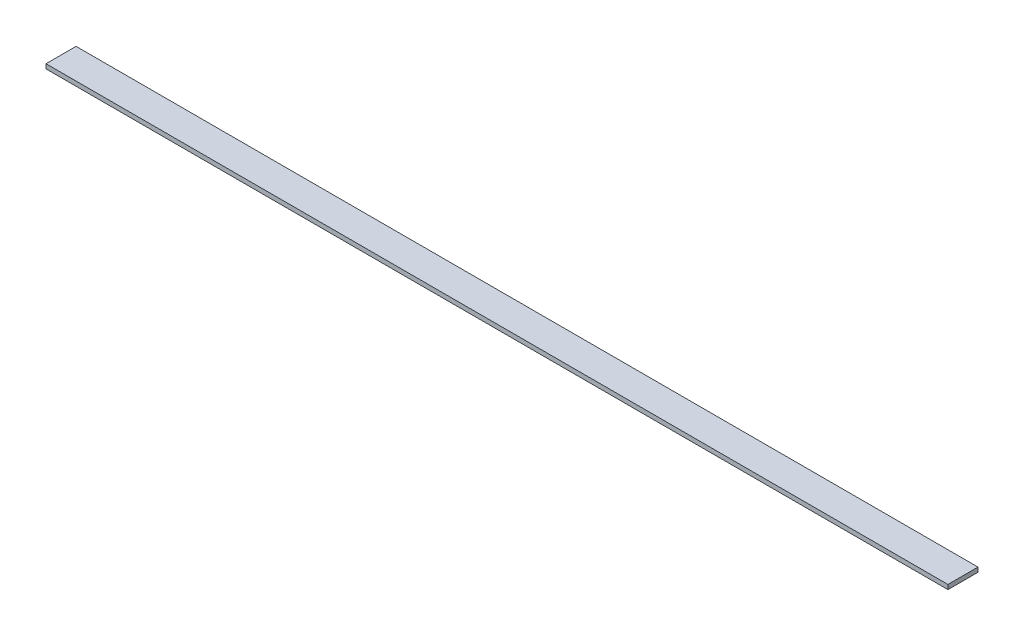
ISO-10303-21;
HEADER;
FILE_DESCRIPTION(('STEP AP214'),'2;1');
FILE_NAME('part.step','',(''),(''),'','','');
FILE_SCHEMA(('AUTOMOTIVE_DESIGN { 1 0 10303 214 1 1 1 1 }'));
ENDSEC;
DATA;
#1=APPLICATION_CONTEXT('core data for automotive mechanical design processes');
#2=APPLICATION_PROTOCOL_DEFINITION('international standard','automotive_design',2000,#1);
#3=PRODUCT_CONTEXT('',#1,'mechanical');
#4=PRODUCT('Part','Part','',(#3));
#5=PRODUCT_RELATED_PRODUCT_CATEGORY('part','',(#4));
#6=PRODUCT_DEFINITION_FORMATION('','',#4);
#7=PRODUCT_DEFINITION_CONTEXT('part definition',#1,'design');
#8=PRODUCT_DEFINITION('design','',#6,#7);
#9=PRODUCT_DEFINITION_SHAPE('','',#8);
#10=(LENGTH_UNIT() NAMED_UNIT(*) SI_UNIT(.MILLI.,.METRE.));
#11=(NAMED_UNIT(*) PLANE_ANGLE_UNIT() SI_UNIT($,.RADIAN.));
#12=(NAMED_UNIT(*) SI_UNIT($,.STERADIAN.) SOLID_ANGLE_UNIT());
#13=UNCERTAINTY_MEASURE_WITH_UNIT(LENGTH_MEASURE(1.E-05),#10,'distance_accuracy_value','');
#14=(GEOMETRIC_REPRESENTATION_CONTEXT(3) GLOBAL_UNCERTAINTY_ASSIGNED_CONTEXT((#13)) GLOBAL_UNIT_ASSIGNED_CONTEXT((#10,
#11,#12)) REPRESENTATION_CONTEXT('',''));
#15=CARTESIAN_POINT('',(0.,0.,0.));
#16=DIRECTION('',(0.,0.,1.));
#17=DIRECTION('',(1.,0.,0.));
#18=AXIS2_PLACEMENT_3D('',#15,#16,#17);
#19=CARTESIAN_POINT('',(223.705920750169,3.,-210.276222509931));
#20=DIRECTION('',(-1.,0.,0.));
#21=DIRECTION('',(0.,0.,1.));
#22=AXIS2_PLACEMENT_3D('',#19,#20,#21);
#23=PLANE('',#22);
#24=DIRECTION('',(0.,0.,-1.));
#25=VECTOR('',#24,1.);
#26=CARTESIAN_POINT('',(223.705920750169,0.,-210.276222509931));
#27=LINE('',#26,#25);
#28=CARTESIAN_POINT('',(223.705920750169,0.,-210.276222509931));
#29=VERTEX_POINT('',#28);
#30=CARTESIAN_POINT('',(223.705920750169,0.,-230.276222509931));
#31=VERTEX_POINT('',#30);
#32=EDGE_CURVE('E97',#29,#31,#27,.T.);
#33=ORIENTED_EDGE('',*,*,#32,.T.);
#34=DIRECTION('',(0.,-1.,0.));
#35=VECTOR('',#34,1.);
#36=CARTESIAN_POINT('',(223.705920750169,3.,-230.276222509931));
#37=LINE('',#36,#35);
#38=CARTESIAN_POINT('',(223.705920750169,3.,-230.276222509931));
#39=VERTEX_POINT('',#38);
#40=EDGE_CURVE('E11',#39,#31,#37,.T.);
#41=ORIENTED_EDGE('',*,*,#40,.F.);
#42=DIRECTION('',(0.,0.,-1.));
#43=VECTOR('',#42,1.);
#44=CARTESIAN_POINT('',(223.705920750169,3.,-210.276222509931));
#45=LINE('',#44,#43);
#46=CARTESIAN_POINT('',(223.705920750169,3.,-210.276222509931));
#47=VERTEX_POINT('',#46);
#48=EDGE_CURVE('E85',#47,#39,#45,.T.);
#49=ORIENTED_EDGE('',*,*,#48,.F.);
#50=DIRECTION('',(0.,-1.,0.));
#51=VECTOR('',#50,1.);
#52=CARTESIAN_POINT('',(223.705920750169,3.,-210.276222509931));
#53=LINE('',#52,#51);
#54=EDGE_CURVE('E93',#47,#29,#53,.T.);
#55=ORIENTED_EDGE('',*,*,#54,.T.);
#56=EDGE_LOOP('',(#33,#41,#49,#55));
#57=FACE_BOUND('',#56,.T.);
#58=ADVANCED_FACE('F34',(#57),#23,.F.);
#59=CARTESIAN_POINT('',(223.705920750169,3.,-230.276222509931));
#60=DIRECTION('',(0.,0.,1.));
#61=DIRECTION('',(1.,0.,0.));
#62=AXIS2_PLACEMENT_3D('',#59,#60,#61);
#63=PLANE('',#62);
#64=DIRECTION('',(-1.,0.,0.));
#65=VECTOR('',#64,1.);
#66=CARTESIAN_POINT('',(223.705920750169,0.,-230.276222509931));
#67=LINE('',#66,#65);
#68=CARTESIAN_POINT('',(-376.294079249831,0.,-230.276222509931));
#69=VERTEX_POINT('',#68);
#70=EDGE_CURVE('E89',#31,#69,#67,.T.);
#71=ORIENTED_EDGE('',*,*,#70,.T.);
#72=DIRECTION('',(0.,-1.,0.));
#73=VECTOR('',#72,1.);
#74=CARTESIAN_POINT('',(-376.294079249831,3.,-230.276222509931));
#75=LINE('',#74,#73);
#76=CARTESIAN_POINT('',(-376.294079249831,3.,-230.276222509931));
#77=VERTEX_POINT('',#76);
#78=EDGE_CURVE('E42',#77,#69,#75,.T.);
#79=ORIENTED_EDGE('',*,*,#78,.F.);
#80=DIRECTION('',(-1.,0.,0.));
#81=VECTOR('',#80,1.);
#82=CARTESIAN_POINT('',(223.705920750169,3.,-230.276222509931));
#83=LINE('',#82,#81);
#84=EDGE_CURVE('E80',#39,#77,#83,.T.);
#85=ORIENTED_EDGE('',*,*,#84,.F.);
#86=ORIENTED_EDGE('',*,*,#40,.T.);
#87=EDGE_LOOP('',(#71,#79,#85,#86));
#88=FACE_BOUND('',#87,.T.);
#89=ADVANCED_FACE('F88',(#88),#63,.F.);
#90=CARTESIAN_POINT('',(-376.294079249831,3.,-210.276222509931));
#91=DIRECTION('',(1.,0.,0.));
#92=DIRECTION('',(0.,0.,-1.));
#93=AXIS2_PLACEMENT_3D('',#90,#91,#92);
#94=PLANE('',#93);
#95=DIRECTION('',(0.,0.,1.));
#96=VECTOR('',#95,1.);
#97=CARTESIAN_POINT('',(-376.294079249831,0.,-210.276222509931));
#98=LINE('',#97,#96);
#99=CARTESIAN_POINT('',(-376.294079249831,0.,-210.276222509931));
#100=VERTEX_POINT('',#99);
#101=EDGE_CURVE('E67',#69,#100,#98,.T.);
#102=ORIENTED_EDGE('',*,*,#101,.T.);
#103=DIRECTION('',(0.,-1.,0.));
#104=VECTOR('',#103,1.);
#105=CARTESIAN_POINT('',(-376.294079249831,3.,-210.276222509931));
#106=LINE('',#105,#104);
#107=CARTESIAN_POINT('',(-376.294079249831,3.,-210.276222509931));
#108=VERTEX_POINT('',#107);
#109=EDGE_CURVE('E90',#108,#100,#106,.T.);
#110=ORIENTED_EDGE('',*,*,#109,.F.);
#111=DIRECTION('',(0.,0.,1.));
#112=VECTOR('',#111,1.);
#113=CARTESIAN_POINT('',(-376.294079249831,3.,-210.276222509931));
#114=LINE('',#113,#112);
#115=EDGE_CURVE('E83',#77,#108,#114,.T.);
#116=ORIENTED_EDGE('',*,*,#115,.F.);
#117=ORIENTED_EDGE('',*,*,#78,.T.);
#118=EDGE_LOOP('',(#102,#110,#116,#117));
#119=FACE_BOUND('',#118,.T.);
#120=ADVANCED_FACE('F91',(#119),#94,.F.);
#121=CARTESIAN_POINT('',(223.705920750169,3.,-210.276222509931));
#122=DIRECTION('',(0.,0.,-1.));
#123=DIRECTION('',(-1.,0.,0.));
#124=AXIS2_PLACEMENT_3D('',#121,#122,#123);
#125=PLANE('',#124);
#126=DIRECTION('',(1.,0.,0.));
#127=VECTOR('',#126,1.);
#128=CARTESIAN_POINT('',(223.705920750169,0.,-210.276222509931));
#129=LINE('',#128,#127);
#130=EDGE_CURVE('E73',#100,#29,#129,.T.);
#131=ORIENTED_EDGE('',*,*,#130,.T.);
#132=ORIENTED_EDGE('',*,*,#54,.F.);
#133=DIRECTION('',(1.,0.,0.));
#134=VECTOR('',#133,1.);
#135=CARTESIAN_POINT('',(223.705920750169,3.,-210.276222509931));
#136=LINE('',#135,#134);
#137=EDGE_CURVE('E50',#108,#47,#136,.T.);
#138=ORIENTED_EDGE('',*,*,#137,.F.);
#139=ORIENTED_EDGE('',*,*,#109,.T.);
#140=EDGE_LOOP('',(#131,#132,#138,#139));
#141=FACE_BOUND('',#140,.T.);
#142=ADVANCED_FACE('F104',(#141),#125,.F.);
#143=CARTESIAN_POINT('',(0.,3.,0.));
#144=DIRECTION('',(0.,1.,0.));
#145=DIRECTION('',(0.,0.,1.));
#146=AXIS2_PLACEMENT_3D('',#143,#144,#145);
#147=PLANE('',#146);
#148=ORIENTED_EDGE('',*,*,#48,.T.);
#149=ORIENTED_EDGE('',*,*,#84,.T.);
#150=ORIENTED_EDGE('',*,*,#115,.T.);
#151=ORIENTED_EDGE('',*,*,#137,.T.);
#152=EDGE_LOOP('',(#148,#149,#150,#151));
#153=FACE_BOUND('',#152,.T.);
#154=ADVANCED_FACE('F81',(#153),#147,.T.);
#155=CARTESIAN_POINT('',(0.,0.,0.));
#156=DIRECTION('',(0.,1.,0.));
#157=DIRECTION('',(0.,0.,1.));
#158=AXIS2_PLACEMENT_3D('',#155,#156,#157);
#159=PLANE('',#158);
#160=ORIENTED_EDGE('',*,*,#32,.F.);
#161=ORIENTED_EDGE('',*,*,#130,.F.);
#162=ORIENTED_EDGE('',*,*,#101,.F.);
#163=ORIENTED_EDGE('',*,*,#70,.F.);
#164=EDGE_LOOP('',(#160,#161,#162,#163));
#165=FACE_BOUND('',#164,.T.);
#166=ADVANCED_FACE('F107',(#165),#159,.F.);
#167=CLOSED_SHELL('',(#58,#89,#120,#142,#154,#166));
#168=MANIFOLD_SOLID_BREP('B2',#167);
#169=ADVANCED_BREP_SHAPE_REPRESENTATION('',(#18,#168),#14);
#170=SHAPE_DEFINITION_REPRESENTATION(#9,#169);
ENDSEC;
END-ISO-10303-21;
